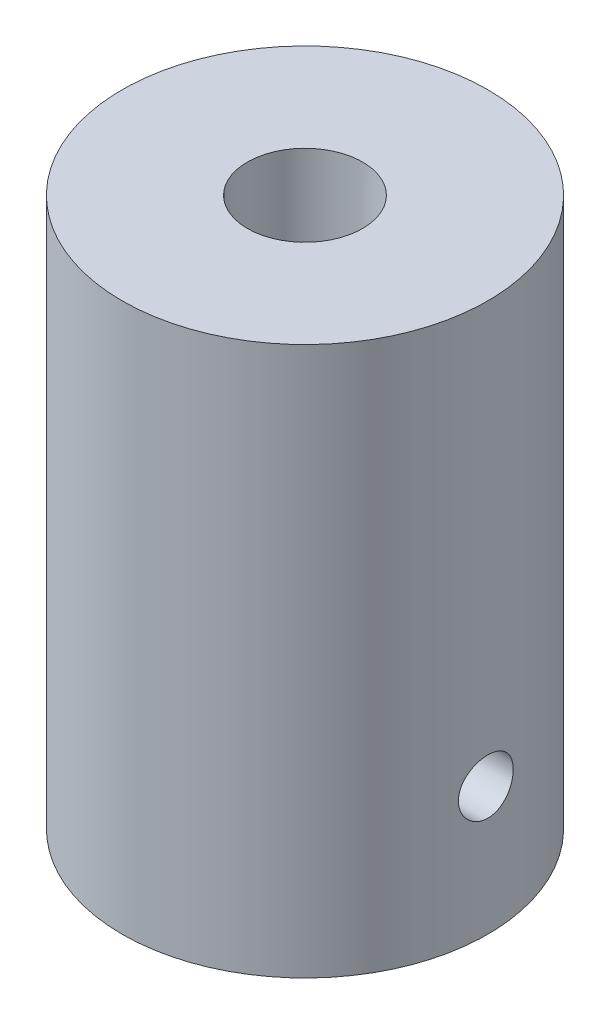
ISO-10303-21;
HEADER;
FILE_DESCRIPTION(('STEP AP214'),'2;1');
FILE_NAME('part.step','',(''),(''),'','','');
FILE_SCHEMA(('AUTOMOTIVE_DESIGN { 1 0 10303 214 1 1 1 1 }'));
ENDSEC;
DATA;
#1=APPLICATION_CONTEXT('core data for automotive mechanical design processes');
#2=APPLICATION_PROTOCOL_DEFINITION('international standard','automotive_design',2000,#1);
#3=PRODUCT_CONTEXT('',#1,'mechanical');
#4=PRODUCT('Part','Part','',(#3));
#5=PRODUCT_RELATED_PRODUCT_CATEGORY('part','',(#4));
#6=PRODUCT_DEFINITION_FORMATION('','',#4);
#7=PRODUCT_DEFINITION_CONTEXT('part definition',#1,'design');
#8=PRODUCT_DEFINITION('design','',#6,#7);
#9=PRODUCT_DEFINITION_SHAPE('','',#8);
#10=(LENGTH_UNIT() NAMED_UNIT(*) SI_UNIT(.MILLI.,.METRE.));
#11=(NAMED_UNIT(*) PLANE_ANGLE_UNIT() SI_UNIT($,.RADIAN.));
#12=(NAMED_UNIT(*) SI_UNIT($,.STERADIAN.) SOLID_ANGLE_UNIT());
#13=UNCERTAINTY_MEASURE_WITH_UNIT(LENGTH_MEASURE(1.E-05),#10,'distance_accuracy_value','');
#14=(GEOMETRIC_REPRESENTATION_CONTEXT(3) GLOBAL_UNCERTAINTY_ASSIGNED_CONTEXT((#13)) GLOBAL_UNIT_ASSIGNED_CONTEXT((#10,
#11,#12)) REPRESENTATION_CONTEXT('',''));
#15=CARTESIAN_POINT('',(0.,0.,0.));
#16=DIRECTION('',(0.,0.,1.));
#17=DIRECTION('',(1.,0.,0.));
#18=AXIS2_PLACEMENT_3D('',#15,#16,#17);
#19=CARTESIAN_POINT('',(0.,30.,0.));
#20=DIRECTION('',(0.,-1.,0.));
#21=DIRECTION('',(0.,0.,-1.));
#22=AXIS2_PLACEMENT_3D('',#19,#20,#21);
#23=CYLINDRICAL_SURFACE('',#22,10.);
#24=CARTESIAN_POINT('',(0.,0.,0.));
#25=DIRECTION('',(0.,1.,0.));
#26=DIRECTION('',(0.,0.,1.));
#27=AXIS2_PLACEMENT_3D('',#24,#25,#26);
#28=CIRCLE('',#27,10.);
#29=CARTESIAN_POINT('',(0.,0.,10.));
#30=VERTEX_POINT('',#29);
#31=EDGE_CURVE('E50',#30,#30,#28,.T.);
#32=ORIENTED_EDGE('',*,*,#31,.T.);
#33=EDGE_LOOP('',(#32));
#34=FACE_BOUND('',#33,.T.);
#35=CARTESIAN_POINT('',(0.,30.,0.));
#36=DIRECTION('',(0.,1.,0.));
#37=DIRECTION('',(0.,0.,1.));
#38=AXIS2_PLACEMENT_3D('',#35,#36,#37);
#39=CIRCLE('',#38,10.);
#40=CARTESIAN_POINT('',(0.,30.,10.));
#41=VERTEX_POINT('',#40);
#42=EDGE_CURVE('E46',#41,#41,#39,.T.);
#43=ORIENTED_EDGE('',*,*,#42,.F.);
#44=EDGE_LOOP('',(#43));
#45=FACE_BOUND('',#44,.T.);
#46=CARTESIAN_POINT('',(9.88685996664259,7.,-1.5));
#47=CARTESIAN_POINT('',(9.88686136668593,6.91625443071005,-1.49999654107284));
#48=CARTESIAN_POINT('',(9.88793551739101,6.83246024924929,-1.49296296388491));
#49=CARTESIAN_POINT('',(9.8921131480324,6.66721468511687,-1.46502196657001));
#50=CARTESIAN_POINT('',(9.8952186073143,6.58576566851999,-1.44410101402628));
#51=CARTESIAN_POINT('',(9.90309938986228,6.4276262445531,-1.38902526098084));
#52=CARTESIAN_POINT('',(9.90787343131536,6.35093223745784,-1.35488061681397));
#53=CARTESIAN_POINT('',(9.91855194113145,6.20437296922792,-1.27435063087791));
#54=CARTESIAN_POINT('',(9.92445625383668,6.1345067697857,-1.22796697429872));
#55=CARTESIAN_POINT('',(9.9367828924804,6.00301618324567,-1.12387902418558));
#56=CARTESIAN_POINT('',(9.94320862458057,5.94145438659326,-1.0660960558482));
#57=CARTESIAN_POINT('',(9.95582368169047,5.8288625143445,-0.941019605444373));
#58=CARTESIAN_POINT('',(9.96201299368615,5.77783301783301,-0.873725600786529));
#59=CARTESIAN_POINT('',(9.97349347428185,5.68752336830864,-0.731136358052745));
#60=CARTESIAN_POINT('',(9.97878018435569,5.64830084967754,-0.655804227365767));
#61=CARTESIAN_POINT('',(9.98782206746405,5.58308840119182,-0.499528850106974));
#62=CARTESIAN_POINT('',(9.99157732141945,5.55709777215711,-0.418585900270677));
#63=CARTESIAN_POINT('',(9.99710914797782,5.51927661146916,-0.254031123090569));
#64=CARTESIAN_POINT('',(9.99890035887344,5.50734127361283,-0.170443884389866));
#65=CARTESIAN_POINT('',(10.0003524476958,5.4976440651751,-0.0024352040194791));
#66=CARTESIAN_POINT('',(10.0000134440494,5.49988140668031,0.0819861910157462));
#67=CARTESIAN_POINT('',(9.99725499660796,5.51838333776243,0.24855171820052));
#68=CARTESIAN_POINT('',(9.99485227652479,5.53453517179148,0.330708691400007));
#69=CARTESIAN_POINT('',(9.98825500227851,5.58023060632257,0.491132829143137));
#70=CARTESIAN_POINT('',(9.98406040199739,5.60977455150144,0.569399893513481));
#71=CARTESIAN_POINT('',(9.97432193873206,5.6815309969171,0.720163780770317));
#72=CARTESIAN_POINT('',(9.96877303515638,5.72379096510874,0.792637672323596));
#73=CARTESIAN_POINT('',(9.95694438245421,5.81974519366999,0.929507907150177));
#74=CARTESIAN_POINT('',(9.95066458523184,5.87344020670686,0.993903718271735));
#75=CARTESIAN_POINT('',(9.93800158192627,5.99136844882659,1.11345448272265));
#76=CARTESIAN_POINT('',(9.93161796623257,6.05570012197011,1.16851232950947));
#77=CARTESIAN_POINT('',(9.91952704453523,6.19274107712373,1.26706599338813));
#78=CARTESIAN_POINT('',(9.91381974269649,6.26545041071992,1.31056173927999));
#79=CARTESIAN_POINT('',(9.90372775286855,6.41728396294064,1.38476964534605));
#80=CARTESIAN_POINT('',(9.89934409845291,6.49641313366239,1.41547182270082));
#81=CARTESIAN_POINT('',(9.89241402899059,6.65878525514739,1.46312336208879));
#82=CARTESIAN_POINT('',(9.88986748446299,6.74202791554675,1.48007369337326));
#83=CARTESIAN_POINT('',(9.88692451395027,6.90940008957749,1.49960720086655));
#84=CARTESIAN_POINT('',(9.88650748802574,6.99351318820153,1.50232803265052));
#85=CARTESIAN_POINT('',(9.88781607937153,7.16099419481734,1.49369057019819));
#86=CARTESIAN_POINT('',(9.88954163015778,7.24436212585077,1.48233271282302));
#87=CARTESIAN_POINT('',(9.89492202461453,7.40755981796563,1.44597702952766));
#88=CARTESIAN_POINT('',(9.89856716482858,7.4874052049416,1.42104778527821));
#89=CARTESIAN_POINT('',(9.90736801825768,7.64178409204861,1.35832831947087));
#90=CARTESIAN_POINT('',(9.91252380607176,7.7163173296282,1.32053746276389));
#91=CARTESIAN_POINT('',(9.92381355687063,7.85857326033504,1.23283677995324));
#92=CARTESIAN_POINT('',(9.92995459279988,7.92624044727982,1.18283784561766));
#93=CARTESIAN_POINT('',(9.94250159433355,8.05227285987381,1.07226416837201));
#94=CARTESIAN_POINT('',(9.94890757490292,8.11063755918115,1.0116888274468));
#95=CARTESIAN_POINT('',(9.96132705217386,8.21690260663359,0.881075619628184));
#96=CARTESIAN_POINT('',(9.96733683460423,8.26471172824248,0.810963126771957));
#97=CARTESIAN_POINT('',(9.97822905032016,8.34787290526264,0.66362208026368));
#98=CARTESIAN_POINT('',(9.98311151444563,8.38322530146503,0.586393721360438));
#99=CARTESIAN_POINT('',(9.99118269660795,8.44032374248803,0.427297995861146));
#100=CARTESIAN_POINT('',(9.99437761717899,8.46211966707836,0.345448858754302));
#101=CARTESIAN_POINT('',(9.99873976656896,8.49164787953747,0.179200815501193));
#102=CARTESIAN_POINT('',(9.99990712930801,8.49938109624914,0.0948020781305808));
#103=CARTESIAN_POINT('',(10.0000812905914,8.5005417045494,-0.0732645908608184));
#104=CARTESIAN_POINT('',(9.99910917023796,8.49410868087698,-0.156931570212052));
#105=CARTESIAN_POINT('',(9.99515610519141,8.46741861157924,-0.321979795323107));
#106=CARTESIAN_POINT('',(9.99217516692666,8.44716161019144,-0.403361048396513));
#107=CARTESIAN_POINT('',(9.98453786742463,8.39344812442976,-0.561489374379661));
#108=CARTESIAN_POINT('',(9.97988273316947,8.36000130486107,-0.638239793148782));
#109=CARTESIAN_POINT('',(9.96940834495499,8.28087251201686,-0.785061117896602));
#110=CARTESIAN_POINT('',(9.96358905320338,8.23519014151966,-0.855131806920709));
#111=CARTESIAN_POINT('',(9.95136510636178,8.13238230117083,-0.987312585191959));
#112=CARTESIAN_POINT('',(9.94495548425942,8.07515377418366,-1.04934206644638));
#113=CARTESIAN_POINT('',(9.93231001689001,7.95109492691953,-1.16296808390268));
#114=CARTESIAN_POINT('',(9.92607421276291,7.88426235617565,-1.21456216798984));
#115=CARTESIAN_POINT('',(9.91444484029116,7.74245101676746,-1.30611310822974));
#116=CARTESIAN_POINT('',(9.90905620156985,7.66742858297817,-1.34600294291209));
#117=CARTESIAN_POINT('',(9.89978909110724,7.5117032232367,-1.41255613872045));
#118=CARTESIAN_POINT('',(9.89590905307931,7.43100629214218,-1.43923322574898));
#119=CARTESIAN_POINT('',(9.89099485524825,7.29162256374352,-1.47254951890026));
#120=CARTESIAN_POINT('',(9.88945249382379,7.23379660307573,-1.4828276978042));
#121=CARTESIAN_POINT('',(9.88738456567011,7.11732170826565,-1.49655410576574));
#122=CARTESIAN_POINT('',(9.88685898576155,7.05867278480039,-1.50000242335076));
#123=CARTESIAN_POINT('',(9.88685996664259,7.,-1.5));
#124=B_SPLINE_CURVE_WITH_KNOTS('',3,(#46,#47,#48,#49,#50,#51,#52,#53,#54,#55,#56,#57,#58,#59,
#60,#61,#62,#63,#64,#65,#66,#67,#68,#69,#70,#71,#72,#73,#74,#75,#76,#77,#78,#79,#80,#81,#82,#83,
#84,#85,#86,#87,#88,#89,#90,#91,#92,#93,#94,#95,#96,#97,#98,#99,#100,#101,#102,#103,#104,#105,
#106,#107,#108,#109,#110,#111,#112,#113,#114,#115,#116,#117,#118,#119,#120,#121,#122,#123),
.UNSPECIFIED.,.T.,.F.,(4,2,2,2,2,2,2,2,2,2,2,2,2,2,2,2,2,2,2,2,2,2,2,2,2,2,2,2,2,2,2,2,2,2,2,2,
2,2,4),(0.,0.251022251804869,0.502289469561802,0.753364085335675,1.00440414866133,
1.25724158649108,1.51009292207817,1.76415922105782,2.01821209364501,2.27035832534397,
2.52249053939374,2.77259862515728,3.02271314839401,3.27377316386453,3.52484970949272,
3.77839544666269,4.0319427451435,4.28568751773139,4.53941440444341,4.79068214603744,
5.04194209099918,5.29194394807374,5.54195815286117,5.79385486001302,6.04576581461802,
6.29977537753516,6.55377799071854,6.8068404089109,7.05988611170473,7.31044963622327,
7.56101235892823,7.81139182257833,8.06177941567107,8.31450950010969,8.56729890236862,
8.82150878824931,9.07545403445564,9.25132441891613,9.42719252376192),.UNSPECIFIED.);
#125=CARTESIAN_POINT('',(9.88685996664259,7.,-1.5));
#126=VERTEX_POINT('',#125);
#127=EDGE_CURVE('E68',#126,#126,#124,.T.);
#128=ORIENTED_EDGE('',*,*,#127,.T.);
#129=EDGE_LOOP('',(#128));
#130=FACE_BOUND('',#129,.T.);
#131=CARTESIAN_POINT('',(-10.,5.5,0.));
#132=CARTESIAN_POINT('',(-9.99999865771297,5.50000345381524,-0.0837515444816421));
#133=CARTESIAN_POINT('',(-9.9989368253704,5.50703800084063,-0.167551685082132));
#134=CARTESIAN_POINT('',(-9.99480315973187,5.53498319998275,-0.332809627994913));
#135=CARTESIAN_POINT('',(-9.99172936938473,5.55590736294489,-0.414265068974229));
#136=CARTESIAN_POINT('',(-9.98391721219526,5.61099250496762,-0.57241808622186));
#137=CARTESIAN_POINT('',(-9.97918010370919,5.64514347950595,-0.649119207826799));
#138=CARTESIAN_POINT('',(-9.96856475911724,5.72568837941686,-0.795690428635254));
#139=CARTESIAN_POINT('',(-9.96268668152773,5.77208060441736,-0.865561474725188));
#140=CARTESIAN_POINT('',(-9.95039170991452,5.87617726493987,-0.997046719562126));
#141=CARTESIAN_POINT('',(-9.94397133890331,5.9339584562082,-1.0585998322255));
#142=CARTESIAN_POINT('',(-9.93134261133238,6.05902768889387,-1.17117490668948));
#143=CARTESIAN_POINT('',(-9.92513426698505,6.12631627677852,-1.22219626272936));
#144=CARTESIAN_POINT('',(-9.91359877458726,6.26890064352249,-1.31249729499943));
#145=CARTESIAN_POINT('',(-9.90827611975031,6.34423424698134,-1.35171787037205));
#146=CARTESIAN_POINT('',(-9.89916211306268,6.50051282064543,-1.41692632171056));
#147=CARTESIAN_POINT('',(-9.89537067775449,6.58145748474389,-1.44291491889163));
#148=CARTESIAN_POINT('',(-9.88978256218673,6.74601804187171,-1.48073198798911));
#149=CARTESIAN_POINT('',(-9.8879711574125,6.82960939340802,-1.49266503640518));
#150=CARTESIAN_POINT('',(-9.88650348970582,6.99762616598728,-1.50235624033932));
#151=CARTESIAN_POINT('',(-9.88684710303147,7.08205153886249,-1.50011520973796));
#152=CARTESIAN_POINT('',(-9.88963718352409,7.24860108019414,-1.48160733250788));
#153=CARTESIAN_POINT('',(-9.89206618761549,7.3307385264848,-1.4654569592775));
#154=CARTESIAN_POINT('',(-9.89872608126367,7.49112436887153,-1.41977117403734));
#155=CARTESIAN_POINT('',(-9.90295702179379,7.56937265488074,-1.39023538337812));
#156=CARTESIAN_POINT('',(-9.91276335545481,7.72011337128286,-1.31849603529736));
#157=CARTESIAN_POINT('',(-9.91834396766526,7.79258196909239,-1.27624314283198));
#158=CARTESIAN_POINT('',(-9.93021707574548,7.92944459578194,-1.18030413128955));
#159=CARTESIAN_POINT('',(-9.93650961832501,7.99383809426937,-1.12661726182478));
#160=CARTESIAN_POINT('',(-9.94917473056209,8.11339766073972,-1.00869493078248));
#161=CARTESIAN_POINT('',(-9.95554747112815,8.16846499028634,-0.944359329642001));
#162=CARTESIAN_POINT('',(-9.96759647648462,8.26703593450726,-0.807307089894186));
#163=CARTESIAN_POINT('',(-9.9732727382251,8.3105394985439,-0.73459041458817));
#164=CARTESIAN_POINT('',(-9.98329515585393,8.38475308649955,-0.582754598213686));
#165=CARTESIAN_POINT('',(-9.98764051925428,8.4154554918403,-0.50363167783678));
#166=CARTESIAN_POINT('',(-9.99450490557069,8.46310938968537,-0.34127318248706));
#167=CARTESIAN_POINT('',(-9.99702405195467,8.48006181181558,-0.2580378859526));
#168=CARTESIAN_POINT('',(-9.99993581133871,8.49960322981669,-0.0906695676436463));
#169=CARTESIAN_POINT('',(-10.0003485209039,8.50232797137932,-0.00655273187047019));
#170=CARTESIAN_POINT('',(-9.99905561015226,8.49369699468898,0.160936677662283));
#171=CARTESIAN_POINT('',(-9.99735005541368,8.4823417123319,0.244309274381877));
#172=CARTESIAN_POINT('',(-9.99202468615333,8.44598589982246,0.407532387431408));
#173=CARTESIAN_POINT('',(-9.98841415207984,8.42105150396915,0.487397963079838));
#174=CARTESIAN_POINT('',(-9.97968235658369,8.35831500253824,0.641814958642999));
#175=CARTESIAN_POINT('',(-9.97456102421565,8.32051229266637,0.7163661287951));
#176=CARTESIAN_POINT('',(-9.96332682468686,8.23279377543614,0.858634979291921));
#177=CARTESIAN_POINT('',(-9.95720701626745,8.18279185998723,0.926299009891566));
#178=CARTESIAN_POINT('',(-9.94467863012165,8.07221418837126,1.05232367317771));
#179=CARTESIAN_POINT('',(-9.93827003562867,8.01163781767535,1.1106837647934));
#180=CARTESIAN_POINT('',(-9.92582264304494,7.88102646682351,1.21693784957195));
#181=CARTESIAN_POINT('',(-9.91978736017588,7.81091707480523,1.26474084747421));
#182=CARTESIAN_POINT('',(-9.90883219104903,7.66358395948823,1.34789129270584));
#183=CARTESIAN_POINT('',(-9.90391227465628,7.58636042847853,1.38323907656436));
#184=CARTESIAN_POINT('',(-9.89577033008645,7.42726246637687,1.44033467323943));
#185=CARTESIAN_POINT('',(-9.89254233006438,7.34540553902876,1.46213037141635));
#186=CARTESIAN_POINT('',(-9.88813382297802,7.17914098456489,1.49165549501586));
#187=CARTESIAN_POINT('',(-9.88695317451771,7.09473353400533,1.49938589183067));
#188=CARTESIAN_POINT('',(-9.88677832610841,6.92667093668422,1.5005378666944));
#189=CARTESIAN_POINT('',(-9.88776226333502,6.84301675824308,1.49410252167313));
#190=CARTESIAN_POINT('',(-9.89175820611174,6.67799473667648,1.46741229544379));
#191=CARTESIAN_POINT('',(-9.89477020841118,6.59662688988661,1.44715743638627));
#192=CARTESIAN_POINT('',(-9.90247526112297,6.43852691776568,1.39345373518665));
#193=CARTESIAN_POINT('',(-9.90716703716075,6.36179132956656,1.36001489324314));
#194=CARTESIAN_POINT('',(-9.91770454557702,6.2149963661976,1.28090667642309));
#195=CARTESIAN_POINT('',(-9.92355031702724,6.14493721719636,1.23523688741502));
#196=CARTESIAN_POINT('',(-9.93580743364938,6.01275694202483,1.13244337659164));
#197=CARTESIAN_POINT('',(-9.94222367881967,5.95071866675293,1.07521369039806));
#198=CARTESIAN_POINT('',(-9.95485788826636,5.83707544521218,0.951148841082834));
#199=CARTESIAN_POINT('',(-9.96107580610759,5.78547292742384,0.884311448350941));
#200=CARTESIAN_POINT('',(-9.9726518579052,5.69391232339264,0.742495707543722));
#201=CARTESIAN_POINT('',(-9.9780050712882,5.65401989078525,0.66747457676476));
#202=CARTESIAN_POINT('',(-9.98720028802959,5.58746148324195,0.511751870248719));
#203=CARTESIAN_POINT('',(-9.99104385565757,5.56078180994631,0.431056277096705));
#204=CARTESIAN_POINT('',(-9.99590939261505,5.52745865728989,0.29166572788933));
#205=CARTESIAN_POINT('',(-9.99743549179557,5.51717739846119,0.233831133495279));
#206=CARTESIAN_POINT('',(-9.99948125947896,5.50344690228736,0.117338971600126));
#207=CARTESIAN_POINT('',(-10.0000009404877,5.49999758004745,0.0586814143344174));
#208=CARTESIAN_POINT('',(-10.,5.5,0.));
#209=B_SPLINE_CURVE_WITH_KNOTS('',3,(#131,#132,#133,#134,#135,#136,#137,#138,#139,#140,#141,
#142,#143,#144,#145,#146,#147,#148,#149,#150,#151,#152,#153,#154,#155,#156,#157,#158,#159,#160,
#161,#162,#163,#164,#165,#166,#167,#168,#169,#170,#171,#172,#173,#174,#175,#176,#177,#178,#179,
#180,#181,#182,#183,#184,#185,#186,#187,#188,#189,#190,#191,#192,#193,#194,#195,#196,#197,#198,
#199,#200,#201,#202,#203,#204,#205,#206,#207,#208),.UNSPECIFIED.,.T.,.F.,(4,2,2,2,2,2,2,2,2,2,2,
2,2,2,2,2,2,2,2,2,2,2,2,2,2,2,2,2,2,2,2,2,2,2,2,2,2,2,4),(0.,0.251040205031663,0.50232496292915,
0.753420023583237,1.0044802241976,1.25729416136843,1.5101226357258,1.76419702395375,
2.01825756225506,2.27041564605924,2.52255925098982,2.77261177195746,3.02267136690361,
3.27371383476159,3.52477278308534,3.77834291255409,4.03191415238668,4.28563608984874,
4.53934087193401,4.79062058544255,5.04189251991155,5.29195148965948,5.54202220376273,
5.79391188036907,6.04581620028629,6.29981366584672,6.55380426808832,6.80689223457168,
7.05996272137177,7.31048888261064,7.56101464229564,7.81135073984147,8.06169531466879,
8.31444829965721,8.56726003468733,8.82146323384733,9.07540233261441,9.25129851978808,
9.42719252123291),.UNSPECIFIED.);
#210=CARTESIAN_POINT('',(-10.,5.5,0.));
#211=VERTEX_POINT('',#210);
#212=EDGE_CURVE('E105',#211,#211,#209,.T.);
#213=ORIENTED_EDGE('',*,*,#212,.T.);
#214=EDGE_LOOP('',(#213));
#215=FACE_BOUND('',#214,.T.);
#216=CARTESIAN_POINT('',(0.,27.,-10.));
#217=CARTESIAN_POINT('',(0.1645772255066,26.9999980050302,-9.99999858501101));
#218=CARTESIAN_POINT('',(0.329174636703059,26.9864122727521,-9.99589831387907));
#219=CARTESIAN_POINT('',(0.653576250609761,26.9325572915558,-9.97994211187382));
#220=CARTESIAN_POINT('',(0.81337900882284,26.8922800839533,-9.96808386779384));
#221=CARTESIAN_POINT('',(1.12346541550905,26.7865079661795,-9.93791105003673));
#222=CARTESIAN_POINT('',(1.27376272879075,26.7210502607621,-9.91960600500851));
#223=CARTESIAN_POINT('',(1.56124836210626,26.5669278138883,-9.87844218475291));
#224=CARTESIAN_POINT('',(1.69843493493934,26.4782599852092,-9.85558280384133));
#225=CARTESIAN_POINT('',(1.95974359436749,26.2775519850547,-9.80701474385548));
#226=CARTESIAN_POINT('',(2.08343614248868,26.1649667482282,-9.78124767314073));
#227=CARTESIAN_POINT('',(2.31049841846647,25.9207815401796,-9.73011668420884));
#228=CARTESIAN_POINT('',(2.41386472654881,25.7891783757501,-9.70475283449003));
#229=CARTESIAN_POINT('',(2.59960075447415,25.5070584939248,-9.65668227987544));
#230=CARTESIAN_POINT('',(2.68144618044427,25.3561830780185,-9.63404813327749));
#231=CARTESIAN_POINT('',(2.81842789549521,25.0420214915394,-9.59487240788062));
#232=CARTESIAN_POINT('',(2.87357059839946,24.8787383121441,-9.57832936626621));
#233=CARTESIAN_POINT('',(2.95403267365303,24.5492194677391,-9.55381741676868));
#234=CARTESIAN_POINT('',(2.98014392469355,24.3831945122721,-9.54562138649067));
#235=CARTESIAN_POINT('',(3.00427461229344,24.0489336875665,-9.53805579499534));
#236=CARTESIAN_POINT('',(3.00230085522157,23.8806983638818,-9.53868409521142));
#237=CARTESIAN_POINT('',(2.97093954399623,23.553232182783,-9.54849488135555));
#238=CARTESIAN_POINT('',(2.9425441052537,23.3938954992755,-9.55736777198281));
#239=CARTESIAN_POINT('',(2.86074840854112,23.0823604274531,-9.58216712457248));
#240=CARTESIAN_POINT('',(2.80734568283282,22.9301627452513,-9.59809428264701));
#241=CARTESIAN_POINT('',(2.67632053307363,22.6347993006785,-9.63545466149946));
#242=CARTESIAN_POINT('',(2.59837633869285,22.4917858320895,-9.65696032231904));
#243=CARTESIAN_POINT('',(2.42070445177367,22.2205359559796,-9.70301974000129));
#244=CARTESIAN_POINT('',(2.32097148005177,22.0923031411724,-9.72757423493982));
#245=CARTESIAN_POINT('',(2.09762581531093,21.848627618476,-9.77822022595875));
#246=CARTESIAN_POINT('',(1.97318981493395,21.7339426719407,-9.80433308620996));
#247=CARTESIAN_POINT('',(1.70652651862794,21.5268920318715,-9.85424488126517));
#248=CARTESIAN_POINT('',(1.56429810372178,21.4345277431712,-9.8780436703682));
#249=CARTESIAN_POINT('',(1.26471007668561,21.2742801550705,-9.92086320138941));
#250=CARTESIAN_POINT('',(1.1072554994959,21.2065649675003,-9.93985087336628));
#251=CARTESIAN_POINT('',(0.782490831207041,21.0988008198007,-9.97067043664444));
#252=CARTESIAN_POINT('',(0.615183503179165,21.058744142935,-9.98250432373999));
#253=CARTESIAN_POINT('',(0.281904485336665,21.0086956442012,-9.99736729287077));
#254=CARTESIAN_POINT('',(0.116100195202376,20.9976768283968,-10.0006970083558));
#255=CARTESIAN_POINT('',(-0.214999211646765,21.0031383114242,-9.99905846483519));
#256=CARTESIAN_POINT('',(-0.38029439338156,21.0196149393029,-9.99409131355514));
#257=CARTESIAN_POINT('',(-0.701807210619392,21.078769222223,-9.97661393974325));
#258=CARTESIAN_POINT('',(-0.858145545228337,21.1208467751617,-9.96427659598829));
#259=CARTESIAN_POINT('',(-1.16150927790904,21.2292864655564,-9.9334869568307));
#260=CARTESIAN_POINT('',(-1.30853355405117,21.2956515220757,-9.91503392642188));
#261=CARTESIAN_POINT('',(-1.5928743789221,21.4525063309623,-9.87339308702631));
#262=CARTESIAN_POINT('',(-1.72988765239933,21.543518681896,-9.8501056165928));
#263=CARTESIAN_POINT('',(-1.9870466159603,21.7464495081056,-9.80146937528705));
#264=CARTESIAN_POINT('',(-2.10718806471188,21.8583732237753,-9.7761200886242));
#265=CARTESIAN_POINT('',(-2.33171489102052,22.1047746167387,-9.72506343738007));
#266=CARTESIAN_POINT('',(-2.43536962463001,22.2399237515436,-9.69937650065513));
#267=CARTESIAN_POINT('',(-2.61857990144312,22.5262558780269,-9.65153030477949));
#268=CARTESIAN_POINT('',(-2.69813607658965,22.6774384491158,-9.62937095313121));
#269=CARTESIAN_POINT('',(-2.83034694254316,22.99106498251,-9.5913437922631));
#270=CARTESIAN_POINT('',(-2.88312693874021,23.1534523730757,-9.575446756735));
#271=CARTESIAN_POINT('',(-2.96043461630306,23.4853759378605,-9.55183188739737));
#272=CARTESIAN_POINT('',(-2.98497197957849,23.6549096415661,-9.54411125069387));
#273=CARTESIAN_POINT('',(-3.0044396896993,23.9887230367768,-9.53799944941558));
#274=CARTESIAN_POINT('',(-3.00056110615887,24.1529273020988,-9.53923294700395));
#275=CARTESIAN_POINT('',(-2.9661501088861,24.4782282068012,-9.54998802392188));
#276=CARTESIAN_POINT('',(-2.93561876249408,24.639324970361,-9.55950927135902));
#277=CARTESIAN_POINT('',(-2.84953777608686,24.9518907982633,-9.58551527389243));
#278=CARTESIAN_POINT('',(-2.79430351014248,25.1034545747174,-9.60191209104934));
#279=CARTESIAN_POINT('',(-2.66063014242147,25.3952848776414,-9.63980557805265));
#280=CARTESIAN_POINT('',(-2.58218659925722,25.5355492352831,-9.6613032238508));
#281=CARTESIAN_POINT('',(-2.40097527610176,25.8063262330525,-9.70795352855338));
#282=CARTESIAN_POINT('',(-2.29742552185996,25.9362975225204,-9.7332108032858));
#283=CARTESIAN_POINT('',(-2.07034869259555,26.1774049966162,-9.78402640899066));
#284=CARTESIAN_POINT('',(-1.94681643426898,26.2885362789356,-9.80958481647543));
#285=CARTESIAN_POINT('',(-1.67893152436652,26.4920468245899,-9.85901873141573));
#286=CARTESIAN_POINT('',(-1.53407577158122,26.5837828937109,-9.88282319531421));
#287=CARTESIAN_POINT('',(-1.23028274796706,26.7414703398081,-9.92521360911553));
#288=CARTESIAN_POINT('',(-1.07135210599791,26.807433776549,-9.94380199862114));
#289=CARTESIAN_POINT('',(-0.761515425310566,26.9057905513055,-9.97204349938619));
#290=CARTESIAN_POINT('',(-0.61157392390847,26.9410233457665,-9.9824405476214));
#291=CARTESIAN_POINT('',(-0.307760390461558,26.9881270504832,-9.9964188898898));
#292=CARTESIAN_POINT('',(-0.153889019716279,27.0000018654096,-10.0000013230948));
#293=CARTESIAN_POINT('',(0.,27.,-10.));
#294=B_SPLINE_CURVE_WITH_KNOTS('',3,(#216,#217,#218,#219,#220,#221,#222,#223,#224,#225,#226,
#227,#228,#229,#230,#231,#232,#233,#234,#235,#236,#237,#238,#239,#240,#241,#242,#243,#244,#245,
#246,#247,#248,#249,#250,#251,#252,#253,#254,#255,#256,#257,#258,#259,#260,#261,#262,#263,#264,
#265,#266,#267,#268,#269,#270,#271,#272,#273,#274,#275,#276,#277,#278,#279,#280,#281,#282,#283,
#284,#285,#286,#287,#288,#289,#290,#291,#292,#293),.UNSPECIFIED.,.T.,.F.,(4,2,2,2,2,2,2,2,2,2,2,
2,2,2,2,2,2,2,2,2,2,2,2,2,2,2,2,2,2,2,2,2,2,2,2,2,2,2,4),(0.,0.493166407225221,
0.986479929691998,1.47906735260175,1.9717203288254,2.47711205896383,2.98258874577266,
3.49942962008218,4.01614629086447,4.51839378713197,5.02051956638178,5.50452033395352,
5.98856887316002,6.47924852894238,6.97004720317111,7.48134208096333,7.99266913062143,
8.50742093763377,9.02202907057615,9.5181761887709,10.0142570710065,10.4991349336465,
10.9840710918746,11.4802261140582,11.9765056400038,12.4908080064564,13.0050968850536,
13.516956299025,14.0286401892056,14.5190031093854,15.0093463933232,15.4936008081456,
15.9779479511533,16.4799385136898,16.9820594980412,17.4988599232246,18.0154182319959,
18.4766338387004,18.9377723390687),.UNSPECIFIED.);
#295=CARTESIAN_POINT('',(0.,27.,-10.));
#296=VERTEX_POINT('',#295);
#297=EDGE_CURVE('E11',#296,#296,#294,.T.);
#298=ORIENTED_EDGE('',*,*,#297,.F.);
#299=EDGE_LOOP('',(#298));
#300=FACE_BOUND('',#299,.T.);
#301=ADVANCED_FACE('F35',(#34,#45,#130,#215,#300),#23,.T.);
#302=CARTESIAN_POINT('',(0.,30.,0.));
#303=DIRECTION('',(0.,1.,0.));
#304=DIRECTION('',(0.,0.,1.));
#305=AXIS2_PLACEMENT_3D('',#302,#303,#304);
#306=PLANE('',#305);
#307=ORIENTED_EDGE('',*,*,#42,.T.);
#308=EDGE_LOOP('',(#307));
#309=FACE_BOUND('',#308,.T.);
#310=CARTESIAN_POINT('',(0.,30.,0.));
#311=DIRECTION('',(0.,1.,0.));
#312=DIRECTION('',(0.,0.,1.));
#313=AXIS2_PLACEMENT_3D('',#310,#311,#312);
#314=CIRCLE('',#313,3.15);
#315=CARTESIAN_POINT('',(0.,30.,3.15));
#316=VERTEX_POINT('',#315);
#317=EDGE_CURVE('E55',#316,#316,#314,.T.);
#318=ORIENTED_EDGE('',*,*,#317,.F.);
#319=EDGE_LOOP('',(#318));
#320=FACE_BOUND('',#319,.T.);
#321=ADVANCED_FACE('F126',(#309,#320),#306,.T.);
#322=CARTESIAN_POINT('',(0.,0.,0.));
#323=DIRECTION('',(0.,1.,0.));
#324=DIRECTION('',(0.,0.,1.));
#325=AXIS2_PLACEMENT_3D('',#322,#323,#324);
#326=PLANE('',#325);
#327=CARTESIAN_POINT('',(0.,0.,0.));
#328=DIRECTION('',(0.,-1.,0.));
#329=DIRECTION('',(0.,0.,-1.));
#330=AXIS2_PLACEMENT_3D('',#327,#328,#329);
#331=CIRCLE('',#330,6.15);
#332=CARTESIAN_POINT('',(0.,0.,-6.15));
#333=VERTEX_POINT('',#332);
#334=EDGE_CURVE('E141',#333,#333,#331,.T.);
#335=ORIENTED_EDGE('',*,*,#334,.F.);
#336=EDGE_LOOP('',(#335));
#337=FACE_BOUND('',#336,.T.);
#338=ORIENTED_EDGE('',*,*,#31,.F.);
#339=EDGE_LOOP('',(#338));
#340=FACE_BOUND('',#339,.T.);
#341=ADVANCED_FACE('F122',(#337,#340),#326,.F.);
#342=CARTESIAN_POINT('',(0.,30.,0.));
#343=DIRECTION('',(0.,-1.,0.));
#344=DIRECTION('',(0.,0.,-1.));
#345=AXIS2_PLACEMENT_3D('',#342,#343,#344);
#346=CYLINDRICAL_SURFACE('',#345,3.15);
#347=CARTESIAN_POINT('',(0.,18.,0.));
#348=DIRECTION('',(0.,1.,0.));
#349=DIRECTION('',(0.,0.,1.));
#350=AXIS2_PLACEMENT_3D('',#347,#348,#349);
#351=CIRCLE('',#350,3.15);
#352=CARTESIAN_POINT('',(0.,18.,3.15));
#353=VERTEX_POINT('',#352);
#354=EDGE_CURVE('E69',#353,#353,#351,.T.);
#355=ORIENTED_EDGE('',*,*,#354,.F.);
#356=EDGE_LOOP('',(#355));
#357=FACE_BOUND('',#356,.T.);
#358=CARTESIAN_POINT('',(0.,25.5,-3.15));
#359=CARTESIAN_POINT('',(-0.0793011484345193,25.4999954447438,-3.14999613610138));
#360=CARTESIAN_POINT('',(-0.15870996348523,25.4936742855285,-3.14697264498517));
#361=CARTESIAN_POINT('',(-0.315208513617261,25.4686561091505,-3.13517677935241));
#362=CARTESIAN_POINT('',(-0.392292945433643,25.4499327444997,-3.12639216619045));
#363=CARTESIAN_POINT('',(-0.541635111637403,25.4009931539621,-3.10399935107633));
#364=CARTESIAN_POINT('',(-0.613909796282762,25.3708201093283,-3.0904092853468));
#365=CARTESIAN_POINT('',(-0.752277356394569,25.3000472895054,-3.05967467034871));
#366=CARTESIAN_POINT('',(-0.81837110769052,25.2594489946227,-3.04253062578471));
#367=CARTESIAN_POINT('',(-0.946695373554694,25.1663620521337,-3.00515933023338));
#368=CARTESIAN_POINT('',(-1.00849799653159,25.1133320830068,-2.98481274495377));
#369=CARTESIAN_POINT('',(-1.12271967185533,24.9980445432605,-2.94375464186157));
#370=CARTESIAN_POINT('',(-1.1751322796936,24.935780688449,-2.92304288405296));
#371=CARTESIAN_POINT('',(-1.27267756914474,24.7986522537279,-2.88197559656796));
#372=CARTESIAN_POINT('',(-1.31706410849895,24.7232162507002,-2.86174199222245));
#373=CARTESIAN_POINT('',(-1.3923332977609,24.5648698144613,-2.8258907031909));
#374=CARTESIAN_POINT('',(-1.42322487534392,24.4819643666371,-2.81026996905544));
#375=CARTESIAN_POINT('',(-1.46873623674375,24.3158996819999,-2.78674371390468));
#376=CARTESIAN_POINT('',(-1.48418443811702,24.2330252555178,-2.77844857614719));
#377=CARTESIAN_POINT('',(-1.50092782614371,24.0654790021547,-2.7694433435196));
#378=CARTESIAN_POINT('',(-1.50223481181053,23.9808087327914,-2.76872692520059));
#379=CARTESIAN_POINT('',(-1.49127029818801,23.8216968720744,-2.7746412576418));
#380=CARTESIAN_POINT('',(-1.48042266048844,23.7471219478385,-2.78050167604692));
#381=CARTESIAN_POINT('',(-1.44790003710849,23.6010144314711,-2.79757381572192));
#382=CARTESIAN_POINT('',(-1.42622209801471,23.5294826749857,-2.80878699664816));
#383=CARTESIAN_POINT('',(-1.37223528420531,23.3894810425713,-2.83555853177594));
#384=CARTESIAN_POINT('',(-1.33969125702725,23.3211208246692,-2.85121173121266));
#385=CARTESIAN_POINT('',(-1.26507050207748,23.1905189423513,-2.88509510998969));
#386=CARTESIAN_POINT('',(-1.22298956031526,23.1282800001738,-2.90332642715652));
#387=CARTESIAN_POINT('',(-1.12490418165554,23.0042439444002,-2.94281983523021));
#388=CARTESIAN_POINT('',(-1.06786110946015,22.943300143805,-2.96419095293342));
#389=CARTESIAN_POINT('',(-0.944233180369648,22.8315085002766,-3.00585733587075));
#390=CARTESIAN_POINT('',(-0.877644563382595,22.7806646547418,-3.0261521728102));
#391=CARTESIAN_POINT('',(-0.733538530266771,22.6887032130306,-3.06434011452487));
#392=CARTESIAN_POINT('',(-0.655699110117,22.6480353143346,-3.08211070732667));
#393=CARTESIAN_POINT('',(-0.493220756972297,22.5806864320463,-3.11224020047888));
#394=CARTESIAN_POINT('',(-0.408586792219414,22.5539953339895,-3.12460301315866));
#395=CARTESIAN_POINT('',(-0.2419545290509,22.5173799225542,-3.14172293319281));
#396=CARTESIAN_POINT('',(-0.160259590157498,22.5063173516843,-3.14699484343933));
#397=CARTESIAN_POINT('',(0.00398573947272451,22.4977556649764,-3.15106664340074));
#398=CARTESIAN_POINT('',(0.0865357648079514,22.5002509762669,-3.1498691923019));
#399=CARTESIAN_POINT('',(0.244126829310007,22.518022501294,-3.14144958700607));
#400=CARTESIAN_POINT('',(0.319293784298755,22.5324077247217,-3.13464753103159));
#401=CARTESIAN_POINT('',(0.466016468558539,22.5722014886457,-3.11621543402233));
#402=CARTESIAN_POINT('',(0.537571781170427,22.5976112977693,-3.10458483736162));
#403=CARTESIAN_POINT('',(0.677519457245288,22.6594780881218,-3.07712674109054));
#404=CARTESIAN_POINT('',(0.745750935146266,22.6962456503066,-3.06118305441331));
#405=CARTESIAN_POINT('',(0.875314149420186,22.7794429590623,-3.02668586648184));
#406=CARTESIAN_POINT('',(0.936642845667793,22.8258769374639,-3.00813122334168));
#407=CARTESIAN_POINT('',(1.05655367050474,22.9319776768078,-2.96825545309903));
#408=CARTESIAN_POINT('',(1.11438009360877,22.9924633793408,-2.94683613535877));
#409=CARTESIAN_POINT('',(1.21936589010557,23.1224292795106,-2.90496954344068));
#410=CARTESIAN_POINT('',(1.26651955221867,23.1919142617828,-2.8845227943108));
#411=CARTESIAN_POINT('',(1.35039829539691,23.3412012538675,-2.84624889524826));
#412=CARTESIAN_POINT('',(1.38667733717636,23.4212882346634,-2.82854536467012));
#413=CARTESIAN_POINT('',(1.44486047644506,23.5875540305314,-2.79927779955046));
#414=CARTESIAN_POINT('',(1.46678125770146,23.6737256459853,-2.78770664241447));
#415=CARTESIAN_POINT('',(1.49375240807575,23.8411897141914,-2.77334023860591));
#416=CARTESIAN_POINT('',(1.50017096709468,23.9222002812218,-2.76983469237173));
#417=CARTESIAN_POINT('',(1.49982226490506,24.0841724501743,-2.77002456632111));
#418=CARTESIAN_POINT('',(1.49305918603591,24.165134059477,-2.77371770246889));
#419=CARTESIAN_POINT('',(1.4677859513816,24.3180168574993,-2.78716348629735));
#420=CARTESIAN_POINT('',(1.45024457795198,24.3901473800589,-2.7964151327717));
#421=CARTESIAN_POINT('',(1.40503134733461,24.5303956078148,-2.81940176140385));
#422=CARTESIAN_POINT('',(1.37735642073431,24.5985120899095,-2.83313810182066));
#423=CARTESIAN_POINT('',(1.31056843575477,24.7338107091392,-2.86467419548867));
#424=CARTESIAN_POINT('',(1.27081463509348,24.8006262630856,-2.88268413800923));
#425=CARTESIAN_POINT('',(1.18175725446817,24.927057484519,-2.92032293809374));
#426=CARTESIAN_POINT('',(1.13244904263874,24.986669637032,-2.93995257820702));
#427=CARTESIAN_POINT('',(1.01952204648438,25.1035664801149,-2.9811162472873));
#428=CARTESIAN_POINT('',(0.954939684100026,25.1599319941433,-3.00263118079479));
#429=CARTESIAN_POINT('',(0.816555887380464,25.2611841610645,-3.04317756932567));
#430=CARTESIAN_POINT('',(0.742749967979773,25.3060651969122,-3.06220780686714));
#431=CARTESIAN_POINT('',(0.58784296556551,25.3827119377274,-3.09567514763421));
#432=CARTESIAN_POINT('',(0.506758600085824,25.4145068060675,-3.11012244756426));
#433=CARTESIAN_POINT('',(0.339626978172029,25.4636230849945,-3.1327640429295));
#434=CARTESIAN_POINT('',(0.25359512207132,25.4809870577793,-3.1409767203903));
#435=CARTESIAN_POINT('',(0.139016419188305,25.4938052943649,-3.1470544134513));
#436=CARTESIAN_POINT('',(0.111279827459806,25.4961255925445,-3.1481566274664));
#437=CARTESIAN_POINT('',(0.055699920633061,25.4992237633262,-3.14963010786534));
#438=CARTESIAN_POINT('',(0.027856603074465,25.5000016001529,-3.15000135729548));
#439=CARTESIAN_POINT('',(0.,25.5,-3.15));
#440=B_SPLINE_CURVE_WITH_KNOTS('',3,(#358,#359,#360,#361,#362,#363,#364,#365,#366,#367,#368,
#369,#370,#371,#372,#373,#374,#375,#376,#377,#378,#379,#380,#381,#382,#383,#384,#385,#386,#387,
#388,#389,#390,#391,#392,#393,#394,#395,#396,#397,#398,#399,#400,#401,#402,#403,#404,#405,#406,
#407,#408,#409,#410,#411,#412,#413,#414,#415,#416,#417,#418,#419,#420,#421,#422,#423,#424,#425,
#426,#427,#428,#429,#430,#431,#432,#433,#434,#435,#436,#437,#438,#439),.UNSPECIFIED.,.T.,.F.,(4,
2,2,2,2,2,2,2,2,2,2,2,2,2,2,2,2,2,2,2,2,2,2,2,2,2,2,2,2,2,2,2,2,2,2,2,2,2,2,2,4),(0.,
0.237789842517452,0.476086477582601,0.713493193095541,0.950866217278916,1.20162211873861,
1.45254946391392,1.7206919453767,1.9886567658912,2.24132043053035,2.49377326378467,
2.71948075869402,2.94524983745704,3.1762610442672,3.40737452562168,3.66474139243313,
3.92220991880816,4.18958859746853,4.456773516293,4.70326968731196,4.94966454549389,
5.17911020070263,5.40858226581797,5.64498755049794,5.88149654879373,6.13949221545371,
6.39762561778687,6.66522879080888,6.93252046463056,7.1751869515268,7.41777645645721,
7.64122874659629,7.86474877560043,8.10320477219625,8.34177665996956,8.60567959748526,
8.86971136397191,9.13315149021891,9.39581184591833,9.47933981189934,9.56286971517203),.UNSPECIFIED.);
#441=CARTESIAN_POINT('',(0.,25.5,-3.15));
#442=VERTEX_POINT('',#441);
#443=EDGE_CURVE('E60',#442,#442,#440,.T.);
#444=ORIENTED_EDGE('',*,*,#443,.F.);
#445=EDGE_LOOP('',(#444));
#446=FACE_BOUND('',#445,.T.);
#447=ORIENTED_EDGE('',*,*,#317,.T.);
#448=EDGE_LOOP('',(#447));
#449=FACE_BOUND('',#448,.T.);
#450=ADVANCED_FACE('F77',(#357,#446,#449),#346,.F.);
#451=CARTESIAN_POINT('',(-10.,7.,0.));
#452=DIRECTION('',(1.,0.,0.));
#453=DIRECTION('',(0.,0.,-1.));
#454=AXIS2_PLACEMENT_3D('',#451,#452,#453);
#455=CYLINDRICAL_SURFACE('',#454,1.5);
#456=CARTESIAN_POINT('',(5.96426860562131,7.,-1.5));
#457=CARTESIAN_POINT('',(5.96427022285925,6.91710025792282,-1.49999753233902));
#458=CARTESIAN_POINT('',(5.96601585552037,6.83417275629865,-1.49310422890012));
#459=CARTESIAN_POINT('',(5.97279298363551,6.67069441772661,-1.46575424922005));
#460=CARTESIAN_POINT('',(5.97782648525403,6.59014506324101,-1.44528929182374));
#461=CARTESIAN_POINT('',(5.99057613284617,6.43381127745531,-1.39149388390369));
#462=CARTESIAN_POINT('',(5.99828892184971,6.35802102297158,-1.35817952709373));
#463=CARTESIAN_POINT('',(6.01552396043568,6.21309830667907,-1.27967945891313));
#464=CARTESIAN_POINT('',(6.02504626395185,6.14396604340857,-1.23449339368324));
#465=CARTESIAN_POINT('',(6.04505070247325,6.0128729507059,-1.13252158270998));
#466=CARTESIAN_POINT('',(6.05554756520862,5.95107216661396,-1.07553293553001));
#467=CARTESIAN_POINT('',(6.07619039608016,5.83780459825521,-0.952010908437092));
#468=CARTESIAN_POINT('',(6.08633633253583,5.7863387449876,-0.885476669555553));
#469=CARTESIAN_POINT('',(6.10529657752083,5.69455158546104,-0.743660419885617));
#470=CARTESIAN_POINT('',(6.11409147893624,5.65438683766507,-0.668274261485564));
#471=CARTESIAN_POINT('',(6.12919102425902,5.58735892285414,-0.511570453360256));
#472=CARTESIAN_POINT('',(6.13549601734353,5.56049389059365,-0.430253637228473));
#473=CARTESIAN_POINT('',(6.14480123726312,5.52133875442985,-0.265664471852229));
#474=CARTESIAN_POINT('',(6.14786296978067,5.50877704190526,-0.182460274362189));
#475=CARTESIAN_POINT('',(6.15055077474465,5.49773325026119,-0.0150729372118183));
#476=CARTESIAN_POINT('',(6.15017733161966,5.49924918591155,0.0691100627455682));
#477=CARTESIAN_POINT('',(6.14608289762222,5.51612088747652,0.234183940143098));
#478=CARTESIAN_POINT('',(6.14243280071659,5.53118356761488,0.315106794875999));
#479=CARTESIAN_POINT('',(6.13227735943264,5.57425091842567,0.473239883640906));
#480=CARTESIAN_POINT('',(6.12577186728434,5.60225625889965,0.550449925301079));
#481=CARTESIAN_POINT('',(6.11052699966024,5.67065555715882,0.699746283460894));
#482=CARTESIAN_POINT('',(6.10176867833064,5.71115519566162,0.771782168942678));
#483=CARTESIAN_POINT('',(6.08297036012787,5.80331358696624,0.908138831661974));
#484=CARTESIAN_POINT('',(6.07293015005971,5.85497419697616,0.972458322102058));
#485=CARTESIAN_POINT('',(6.05235873875712,5.96956439455278,1.09330354700279));
#486=CARTESIAN_POINT('',(6.04182155273405,6.0327502123768,1.14958554648516));
#487=CARTESIAN_POINT('',(6.02168184911321,6.16777366290206,1.25080727065237));
#488=CARTESIAN_POINT('',(6.01207937100391,6.23961166084395,1.29574651626938));
#489=CARTESIAN_POINT('',(5.9948759062044,6.39036094724026,1.37315308263775));
#490=CARTESIAN_POINT('',(5.98728396314586,6.46930212531657,1.40556434129192));
#491=CARTESIAN_POINT('',(5.97507874380997,6.63174208245646,1.45658144203031));
#492=CARTESIAN_POINT('',(5.9704648647967,6.71523993557359,1.47519007776682));
#493=CARTESIAN_POINT('',(5.9648639806062,6.88216945644969,1.49767476585069));
#494=CARTESIAN_POINT('',(5.96378855539415,6.96554982516951,1.50191007029705));
#495=CARTESIAN_POINT('',(5.96514610113754,7.13182578261978,1.49650917844225));
#496=CARTESIAN_POINT('',(5.96757876634686,7.21472141296522,1.48687419100062));
#497=CARTESIAN_POINT('',(5.97559391125146,7.37635804605248,1.45432057302977));
#498=CARTESIAN_POINT('',(5.98112731440824,7.45514336678906,1.43160876390348));
#499=CARTESIAN_POINT('',(5.99467434095024,7.60778903074603,1.37377440399408));
#500=CARTESIAN_POINT('',(6.00268824708997,7.68164881133293,1.33865043827458));
#501=CARTESIAN_POINT('',(6.02048113003858,7.82387563295461,1.25622884511308));
#502=CARTESIAN_POINT('',(6.03029041372605,7.8921135540527,1.20871509337358));
#503=CARTESIAN_POINT('',(6.05049333161836,8.01977972296501,1.10313786430319));
#504=CARTESIAN_POINT('',(6.060887056845,8.07920659326244,1.04507274052576));
#505=CARTESIAN_POINT('',(6.08138574181179,8.18900649409501,0.918396933092249));
#506=CARTESIAN_POINT('',(6.09147803002226,8.23913172508439,0.849569036657054));
#507=CARTESIAN_POINT('',(6.10998107514517,8.32711150048537,0.704263550004865));
#508=CARTESIAN_POINT('',(6.11839191849035,8.36496667568729,0.627786353294725));
#509=CARTESIAN_POINT('',(6.13253216231881,8.42701126378974,0.469874604764167));
#510=CARTESIAN_POINT('',(6.13828043256335,8.45129710464457,0.388479709036807));
#511=CARTESIAN_POINT('',(6.14653027637772,8.48580591570392,0.222606086039876));
#512=CARTESIAN_POINT('',(6.14903244439502,8.49603146074234,0.138127926311838));
#513=CARTESIAN_POINT('',(6.15048524014695,8.5019904468544,-0.0291814619572673));
#514=CARTESIAN_POINT('',(6.14952569326937,8.49809041130144,-0.111999059138763));
#515=CARTESIAN_POINT('',(6.1443606851458,8.47674442196297,-0.275760808326509));
#516=CARTESIAN_POINT('',(6.14015531205783,8.4592988360803,-0.356705011153448));
#517=CARTESIAN_POINT('',(6.12898362473641,8.41154952396172,-0.514058929070632));
#518=CARTESIAN_POINT('',(6.12203093341803,8.38130919048012,-0.590488910777958));
#519=CARTESIAN_POINT('',(6.1060987202691,8.30888686645677,-0.737232888305291));
#520=CARTESIAN_POINT('',(6.09711895402088,8.26670343570163,-0.807546145174224));
#521=CARTESIAN_POINT('',(6.07784545243372,8.17045868424534,-0.941809255776527));
#522=CARTESIAN_POINT('',(6.06752627118429,8.11614676373799,-1.00557582261206));
#523=CARTESIAN_POINT('',(6.04685575487278,7.99767722839577,-1.12321447493302));
#524=CARTESIAN_POINT('',(6.03650441240344,7.93351715052924,-1.17708407775515));
#525=CARTESIAN_POINT('',(6.01673588780976,7.79581882216832,-1.27432352561947));
#526=CARTESIAN_POINT('',(6.0073382596602,7.72213590432774,-1.31749278278794));
#527=CARTESIAN_POINT('',(5.99080037507732,7.56834101803653,-1.39076668169376));
#528=CARTESIAN_POINT('',(5.98365842093388,7.48823394187963,-1.4208811553722));
#529=CARTESIAN_POINT('',(5.97359942470276,7.34018186264585,-1.46252125035938));
#530=CARTESIAN_POINT('',(5.97012603680366,7.27296657898493,-1.47654593301339));
#531=CARTESIAN_POINT('',(5.96546004551961,7.13717379597297,-1.4952859722168));
#532=CARTESIAN_POINT('',(5.96426726741808,7.06859640137941,-1.50000204189614));
#533=CARTESIAN_POINT('',(5.96426860562131,7.,-1.5));
#534=B_SPLINE_CURVE_WITH_KNOTS('',3,(#456,#457,#458,#459,#460,#461,#462,#463,#464,#465,#466,
#467,#468,#469,#470,#471,#472,#473,#474,#475,#476,#477,#478,#479,#480,#481,#482,#483,#484,#485,
#486,#487,#488,#489,#490,#491,#492,#493,#494,#495,#496,#497,#498,#499,#500,#501,#502,#503,#504,
#505,#506,#507,#508,#509,#510,#511,#512,#513,#514,#515,#516,#517,#518,#519,#520,#521,#522,#523,
#524,#525,#526,#527,#528,#529,#530,#531,#532,#533),.UNSPECIFIED.,.T.,.F.,(4,2,2,2,2,2,2,2,2,2,2,
2,2,2,2,2,2,2,2,2,2,2,2,2,2,2,2,2,2,2,2,2,2,2,2,2,2,2,4),(0.,0.248447428566474,
0.497046594503298,0.745335398897147,0.993631604859409,1.24661579980316,1.4996227740507,
1.75597921310777,2.01229968874447,2.26366713042692,2.5149991248074,2.76102095619787,
3.00705552100294,3.25523098904937,3.50344778584416,3.7580650565661,4.01269307939832,
4.2684477103665,4.52415056243532,4.7734132573528,5.02265422919895,5.26805747249807,
5.51348869981823,5.76352665529395,6.01360366049528,6.26960420544567,6.52559158759633,
6.77973592150626,7.03383370827065,7.28138607764283,7.52893172362403,7.77526498496119,
8.02162796419091,8.27365043477563,8.52573603938481,8.78224015405681,9.03855075090252,
9.24414735329859,9.44972820439173),.UNSPECIFIED.);
#535=CARTESIAN_POINT('',(5.96426860562131,7.,-1.5));
#536=VERTEX_POINT('',#535);
#537=EDGE_CURVE('E95',#536,#536,#534,.T.);
#538=ORIENTED_EDGE('',*,*,#537,.T.);
#539=EDGE_LOOP('',(#538));
#540=FACE_BOUND('',#539,.T.);
#541=ORIENTED_EDGE('',*,*,#127,.F.);
#542=EDGE_LOOP('',(#541));
#543=FACE_BOUND('',#542,.T.);
#544=ADVANCED_FACE('F90',(#540,#543),#455,.F.);
#545=CARTESIAN_POINT('',(-5.96426860562131,7.,-1.5));
#546=CARTESIAN_POINT('',(-5.96427022285925,7.08289974207718,-1.49999753233902));
#547=CARTESIAN_POINT('',(-5.96601585552037,7.16582724370135,-1.49310422890012));
#548=CARTESIAN_POINT('',(-5.97279298363551,7.32930558227339,-1.46575424922005));
#549=CARTESIAN_POINT('',(-5.97782648525403,7.40985493675899,-1.44528929182374));
#550=CARTESIAN_POINT('',(-5.99057613284617,7.56618872254469,-1.39149388390369));
#551=CARTESIAN_POINT('',(-5.99828892184971,7.64197897702843,-1.35817952709372));
#552=CARTESIAN_POINT('',(-6.01552396043568,7.78690169332093,-1.27967945891313));
#553=CARTESIAN_POINT('',(-6.02504626395185,7.85603395659143,-1.23449339368324));
#554=CARTESIAN_POINT('',(-6.04505070247325,7.9871270492941,-1.13252158270998));
#555=CARTESIAN_POINT('',(-6.05554756520862,8.04892783338604,-1.07553293553001));
#556=CARTESIAN_POINT('',(-6.07619039608016,8.16219540174479,-0.952010908437092));
#557=CARTESIAN_POINT('',(-6.08633633253583,8.2136612550124,-0.885476669555554));
#558=CARTESIAN_POINT('',(-6.10529657752083,8.30544841453896,-0.743660419885618));
#559=CARTESIAN_POINT('',(-6.11409147893624,8.34561316233493,-0.668274261485564));
#560=CARTESIAN_POINT('',(-6.12919102425902,8.41264107714586,-0.511570453360257));
#561=CARTESIAN_POINT('',(-6.13549601734353,8.43950610940635,-0.430253637228474));
#562=CARTESIAN_POINT('',(-6.14480123726312,8.47866124557015,-0.26566447185223));
#563=CARTESIAN_POINT('',(-6.14786296978067,8.49122295809474,-0.18246027436219));
#564=CARTESIAN_POINT('',(-6.15055077474465,8.50226674973882,-0.0150729372118191));
#565=CARTESIAN_POINT('',(-6.15017733161966,8.50075081408846,0.0691100627455676));
#566=CARTESIAN_POINT('',(-6.14608289762222,8.48387911252348,0.234183940143098));
#567=CARTESIAN_POINT('',(-6.14243280071659,8.46881643238513,0.315106794875999));
#568=CARTESIAN_POINT('',(-6.13227735943264,8.42574908157434,0.473239883640905));
#569=CARTESIAN_POINT('',(-6.12577186728434,8.39774374110035,0.550449925301079));
#570=CARTESIAN_POINT('',(-6.11052699966024,8.32934444284118,0.699746283460894));
#571=CARTESIAN_POINT('',(-6.10176867833064,8.28884480433838,0.771782168942678));
#572=CARTESIAN_POINT('',(-6.08297036012787,8.19668641303376,0.908138831661974));
#573=CARTESIAN_POINT('',(-6.07293015005971,8.14502580302384,0.972458322102059));
#574=CARTESIAN_POINT('',(-6.05235873875712,8.03043560544722,1.09330354700279));
#575=CARTESIAN_POINT('',(-6.04182155273405,7.9672497876232,1.14958554648516));
#576=CARTESIAN_POINT('',(-6.02168184911321,7.83222633709794,1.25080727065237));
#577=CARTESIAN_POINT('',(-6.01207937100391,7.76038833915606,1.29574651626938));
#578=CARTESIAN_POINT('',(-5.9948759062044,7.60963905275974,1.37315308263775));
#579=CARTESIAN_POINT('',(-5.98728396314586,7.53069787468343,1.40556434129193));
#580=CARTESIAN_POINT('',(-5.97507874380997,7.36825791754353,1.45658144203032));
#581=CARTESIAN_POINT('',(-5.9704648647967,7.28476006442641,1.47519007776682));
#582=CARTESIAN_POINT('',(-5.9648639806062,7.11783054355031,1.49767476585069));
#583=CARTESIAN_POINT('',(-5.96378855539415,7.03445017483049,1.50191007029705));
#584=CARTESIAN_POINT('',(-5.96514610113754,6.86817421738022,1.49650917844225));
#585=CARTESIAN_POINT('',(-5.96757876634686,6.78527858703478,1.48687419100062));
#586=CARTESIAN_POINT('',(-5.97559391125146,6.62364195394752,1.45432057302977));
#587=CARTESIAN_POINT('',(-5.98112731440824,6.54485663321094,1.43160876390348));
#588=CARTESIAN_POINT('',(-5.99467434095024,6.39221096925397,1.37377440399408));
#589=CARTESIAN_POINT('',(-6.00268824708997,6.31835118866707,1.33865043827458));
#590=CARTESIAN_POINT('',(-6.02048113003858,6.17612436704539,1.25622884511308));
#591=CARTESIAN_POINT('',(-6.03029041372605,6.1078864459473,1.20871509337358));
#592=CARTESIAN_POINT('',(-6.05049333161836,5.98022027703499,1.10313786430319));
#593=CARTESIAN_POINT('',(-6.060887056845,5.92079340673756,1.04507274052576));
#594=CARTESIAN_POINT('',(-6.08138574181179,5.81099350590499,0.918396933092249));
#595=CARTESIAN_POINT('',(-6.09147803002226,5.76086827491561,0.849569036657054));
#596=CARTESIAN_POINT('',(-6.10998107514517,5.67288849951463,0.704263550004864));
#597=CARTESIAN_POINT('',(-6.11839191849035,5.63503332431271,0.627786353294725));
#598=CARTESIAN_POINT('',(-6.13253216231881,5.57298873621026,0.469874604764166));
#599=CARTESIAN_POINT('',(-6.13828043256335,5.54870289535543,0.388479709036807));
#600=CARTESIAN_POINT('',(-6.14653027637772,5.51419408429608,0.222606086039875));
#601=CARTESIAN_POINT('',(-6.14903244439502,5.50396853925766,0.138127926311837));
#602=CARTESIAN_POINT('',(-6.15048524014695,5.4980095531456,-0.0291814619572686));
#603=CARTESIAN_POINT('',(-6.14952569326937,5.50190958869857,-0.111999059138764));
#604=CARTESIAN_POINT('',(-6.1443606851458,5.52325557803703,-0.275760808326511));
#605=CARTESIAN_POINT('',(-6.14015531205783,5.5407011639197,-0.356705011153449));
#606=CARTESIAN_POINT('',(-6.12898362473641,5.58845047603828,-0.514058929070633));
#607=CARTESIAN_POINT('',(-6.12203093341802,5.61869080951989,-0.590488910777958));
#608=CARTESIAN_POINT('',(-6.1060987202691,5.69111313354323,-0.737232888305291));
#609=CARTESIAN_POINT('',(-6.09711895402088,5.73329656429837,-0.807546145174225));
#610=CARTESIAN_POINT('',(-6.07784545243372,5.82954131575466,-0.941809255776528));
#611=CARTESIAN_POINT('',(-6.06752627118429,5.88385323626201,-1.00557582261206));
#612=CARTESIAN_POINT('',(-6.04685575487278,6.00232277160423,-1.12321447493302));
#613=CARTESIAN_POINT('',(-6.03650441240344,6.06648284947076,-1.17708407775515));
#614=CARTESIAN_POINT('',(-6.01673588780976,6.20418117783168,-1.27432352561947));
#615=CARTESIAN_POINT('',(-6.0073382596602,6.27786409567226,-1.31749278278794));
#616=CARTESIAN_POINT('',(-5.99080037507732,6.43165898196347,-1.39076668169376));
#617=CARTESIAN_POINT('',(-5.98365842093388,6.51176605812037,-1.4208811553722));
#618=CARTESIAN_POINT('',(-5.97359942470276,6.65981813735415,-1.46252125035938));
#619=CARTESIAN_POINT('',(-5.97012603680366,6.72703342101507,-1.47654593301339));
#620=CARTESIAN_POINT('',(-5.96546004551961,6.86282620402703,-1.4952859722168));
#621=CARTESIAN_POINT('',(-5.96426726741808,6.93140359862059,-1.50000204189614));
#622=CARTESIAN_POINT('',(-5.96426860562131,7.,-1.5));
#623=B_SPLINE_CURVE_WITH_KNOTS('',3,(#545,#546,#547,#548,#549,#550,#551,#552,#553,#554,#555,
#556,#557,#558,#559,#560,#561,#562,#563,#564,#565,#566,#567,#568,#569,#570,#571,#572,#573,#574,
#575,#576,#577,#578,#579,#580,#581,#582,#583,#584,#585,#586,#587,#588,#589,#590,#591,#592,#593,
#594,#595,#596,#597,#598,#599,#600,#601,#602,#603,#604,#605,#606,#607,#608,#609,#610,#611,#612,
#613,#614,#615,#616,#617,#618,#619,#620,#621,#622),.UNSPECIFIED.,.T.,.F.,(4,2,2,2,2,2,2,2,2,2,2,
2,2,2,2,2,2,2,2,2,2,2,2,2,2,2,2,2,2,2,2,2,2,2,2,2,2,2,4),(0.,0.248447428566474,
0.497046594503298,0.745335398897147,0.993631604859409,1.24661579980315,1.4996227740507,
1.75597921310777,2.01229968874447,2.26366713042692,2.51499912480739,2.76102095619787,
3.00705552100294,3.25523098904938,3.50344778584416,3.7580650565661,4.01269307939832,
4.26844771036651,4.52415056243532,4.7734132573528,5.02265422919895,5.26805747249807,
5.51348869981823,5.76352665529395,6.01360366049528,6.26960420544567,6.52559158759633,
6.77973592150626,7.03383370827065,7.28138607764283,7.52893172362403,7.77526498496119,
8.02162796419091,8.27365043477564,8.52573603938481,8.78224015405681,9.03855075090252,
9.24414735329859,9.44972820439173),.UNSPECIFIED.);
#624=CARTESIAN_POINT('',(-5.96426860562131,7.,-1.5));
#625=VERTEX_POINT('',#624);
#626=EDGE_CURVE('E70',#625,#625,#623,.T.);
#627=ORIENTED_EDGE('',*,*,#626,.T.);
#628=EDGE_LOOP('',(#627));
#629=FACE_BOUND('',#628,.T.);
#630=ORIENTED_EDGE('',*,*,#212,.F.);
#631=EDGE_LOOP('',(#630));
#632=FACE_BOUND('',#631,.T.);
#633=ADVANCED_FACE('F85',(#629,#632),#455,.F.);
#634=CARTESIAN_POINT('',(0.,24.,-10.));
#635=DIRECTION('',(0.,0.,1.));
#636=DIRECTION('',(1.,0.,0.));
#637=AXIS2_PLACEMENT_3D('',#634,#635,#636);
#638=CYLINDRICAL_SURFACE('',#637,1.5);
#639=CARTESIAN_POINT('',(0.,24.,-7.));
#640=DIRECTION('',(0.,0.,1.));
#641=DIRECTION('',(1.,0.,0.));
#642=AXIS2_PLACEMENT_3D('',#639,#640,#641);
#643=CIRCLE('',#642,1.5);
#644=CARTESIAN_POINT('',(1.5,24.,-7.));
#645=VERTEX_POINT('',#644);
#646=EDGE_CURVE('E144',#645,#645,#643,.F.);
#647=ORIENTED_EDGE('',*,*,#646,.T.);
#648=EDGE_LOOP('',(#647));
#649=FACE_BOUND('',#648,.T.);
#650=ORIENTED_EDGE('',*,*,#443,.T.);
#651=EDGE_LOOP('',(#650));
#652=FACE_BOUND('',#651,.T.);
#653=ADVANCED_FACE('F80',(#649,#652),#638,.F.);
#654=CARTESIAN_POINT('',(0.,47.3948268171891,0.));
#655=DIRECTION('',(0.,-1.,0.));
#656=DIRECTION('',(0.,0.,-1.));
#657=AXIS2_PLACEMENT_3D('',#654,#655,#656);
#658=CYLINDRICAL_SURFACE('',#657,6.15);
#659=ORIENTED_EDGE('',*,*,#626,.F.);
#660=EDGE_LOOP('',(#659));
#661=FACE_BOUND('',#660,.T.);
#662=ORIENTED_EDGE('',*,*,#334,.T.);
#663=EDGE_LOOP('',(#662));
#664=FACE_BOUND('',#663,.T.);
#665=CARTESIAN_POINT('',(0.,18.,0.));
#666=DIRECTION('',(0.,1.,0.));
#667=DIRECTION('',(0.,0.,1.));
#668=AXIS2_PLACEMENT_3D('',#665,#666,#667);
#669=CIRCLE('',#668,6.15);
#670=CARTESIAN_POINT('',(0.,18.,6.15));
#671=VERTEX_POINT('',#670);
#672=EDGE_CURVE('E143',#671,#671,#669,.F.);
#673=ORIENTED_EDGE('',*,*,#672,.F.);
#674=EDGE_LOOP('',(#673));
#675=FACE_BOUND('',#674,.T.);
#676=ORIENTED_EDGE('',*,*,#537,.F.);
#677=EDGE_LOOP('',(#676));
#678=FACE_BOUND('',#677,.T.);
#679=ADVANCED_FACE('F84',(#661,#664,#675,#678),#658,.F.);
#680=CARTESIAN_POINT('',(0.,18.,0.));
#681=DIRECTION('',(0.,1.,0.));
#682=DIRECTION('',(0.,0.,1.));
#683=AXIS2_PLACEMENT_3D('',#680,#681,#682);
#684=PLANE('',#683);
#685=ORIENTED_EDGE('',*,*,#354,.T.);
#686=EDGE_LOOP('',(#685));
#687=FACE_BOUND('',#686,.T.);
#688=ORIENTED_EDGE('',*,*,#672,.T.);
#689=EDGE_LOOP('',(#688));
#690=FACE_BOUND('',#689,.T.);
#691=ADVANCED_FACE('F87',(#687,#690),#684,.F.);
#692=CARTESIAN_POINT('',(0.,24.,-7.));
#693=DIRECTION('',(0.,0.,-1.));
#694=DIRECTION('',(-1.,0.,0.));
#695=AXIS2_PLACEMENT_3D('',#692,#693,#694);
#696=CYLINDRICAL_SURFACE('',#695,3.);
#697=CARTESIAN_POINT('',(0.,24.,-7.));
#698=DIRECTION('',(0.,0.,1.));
#699=DIRECTION('',(1.,0.,0.));
#700=AXIS2_PLACEMENT_3D('',#697,#698,#699);
#701=CIRCLE('',#700,3.);
#702=CARTESIAN_POINT('',(3.,24.,-7.));
#703=VERTEX_POINT('',#702);
#704=EDGE_CURVE('E148',#703,#703,#701,.T.);
#705=ORIENTED_EDGE('',*,*,#704,.T.);
#706=EDGE_LOOP('',(#705));
#707=FACE_BOUND('',#706,.T.);
#708=ORIENTED_EDGE('',*,*,#297,.T.);
#709=EDGE_LOOP('',(#708));
#710=FACE_BOUND('',#709,.T.);
#711=ADVANCED_FACE('F153',(#707,#710),#696,.F.);
#712=CARTESIAN_POINT('',(0.,24.,-7.));
#713=DIRECTION('',(0.,0.,1.));
#714=DIRECTION('',(1.,0.,0.));
#715=AXIS2_PLACEMENT_3D('',#712,#713,#714);
#716=PLANE('',#715);
#717=ORIENTED_EDGE('',*,*,#704,.F.);
#718=EDGE_LOOP('',(#717));
#719=FACE_BOUND('',#718,.T.);
#720=ORIENTED_EDGE('',*,*,#646,.F.);
#721=EDGE_LOOP('',(#720));
#722=FACE_BOUND('',#721,.T.);
#723=ADVANCED_FACE('F155',(#719,#722),#716,.F.);
#724=CLOSED_SHELL('',(#301,#321,#341,#450,#544,#633,#653,#679,#691,#711,#723));
#725=MANIFOLD_SOLID_BREP('B2',#724);
#726=ADVANCED_BREP_SHAPE_REPRESENTATION('',(#18,#725),#14);
#727=SHAPE_DEFINITION_REPRESENTATION(#9,#726);
ENDSEC;
END-ISO-10303-21;
